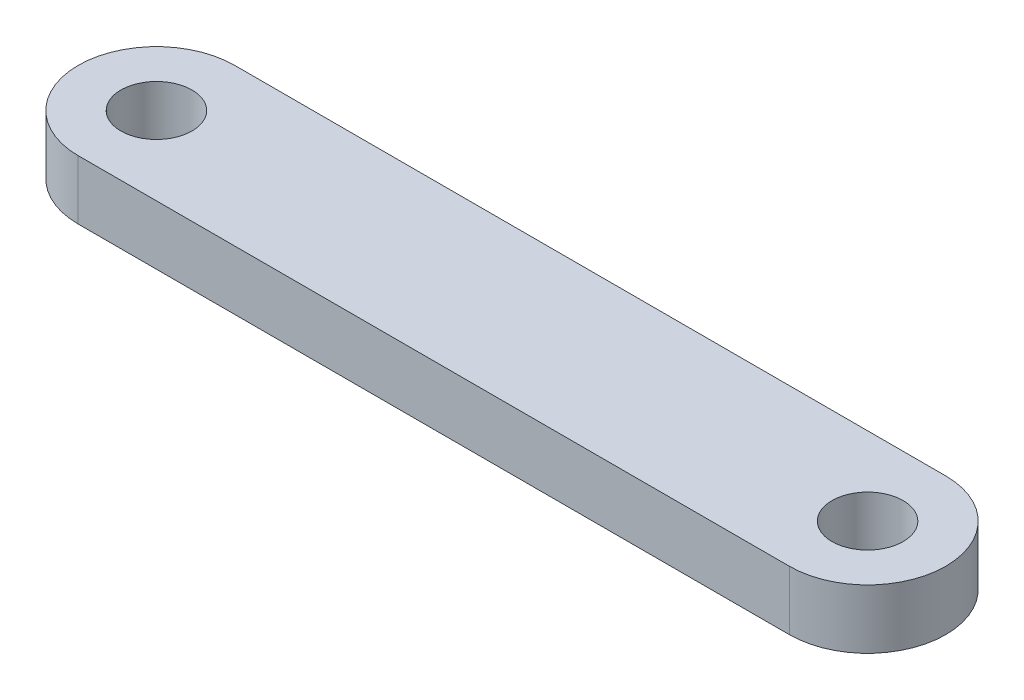
ISO-10303-21;
HEADER;
FILE_DESCRIPTION(('STEP AP214'),'2;1');
FILE_NAME('part.step','',(''),(''),'','','');
FILE_SCHEMA(('AUTOMOTIVE_DESIGN { 1 0 10303 214 1 1 1 1 }'));
ENDSEC;
DATA;
#1=APPLICATION_CONTEXT('core data for automotive mechanical design processes');
#2=APPLICATION_PROTOCOL_DEFINITION('international standard','automotive_design',2000,#1);
#3=PRODUCT_CONTEXT('',#1,'mechanical');
#4=PRODUCT('Part','Part','',(#3));
#5=PRODUCT_RELATED_PRODUCT_CATEGORY('part','',(#4));
#6=PRODUCT_DEFINITION_FORMATION('','',#4);
#7=PRODUCT_DEFINITION_CONTEXT('part definition',#1,'design');
#8=PRODUCT_DEFINITION('design','',#6,#7);
#9=PRODUCT_DEFINITION_SHAPE('','',#8);
#10=(LENGTH_UNIT() NAMED_UNIT(*) SI_UNIT(.MILLI.,.METRE.));
#11=(NAMED_UNIT(*) PLANE_ANGLE_UNIT() SI_UNIT($,.RADIAN.));
#12=(NAMED_UNIT(*) SI_UNIT($,.STERADIAN.) SOLID_ANGLE_UNIT());
#13=UNCERTAINTY_MEASURE_WITH_UNIT(LENGTH_MEASURE(1.E-05),#10,'distance_accuracy_value','');
#14=(GEOMETRIC_REPRESENTATION_CONTEXT(3) GLOBAL_UNCERTAINTY_ASSIGNED_CONTEXT((#13)) GLOBAL_UNIT_ASSIGNED_CONTEXT((#10,
#11,#12)) REPRESENTATION_CONTEXT('',''));
#15=CARTESIAN_POINT('',(0.,0.,0.));
#16=DIRECTION('',(0.,0.,1.));
#17=DIRECTION('',(1.,0.,0.));
#18=AXIS2_PLACEMENT_3D('',#15,#16,#17);
#19=CARTESIAN_POINT('',(0.,12.7,16.764));
#20=DIRECTION('',(0.,0.,-1.));
#21=DIRECTION('',(-1.,0.,0.));
#22=AXIS2_PLACEMENT_3D('',#19,#20,#21);
#23=PLANE('',#22);
#24=DIRECTION('',(1.,0.,0.));
#25=VECTOR('',#24,1.);
#26=CARTESIAN_POINT('',(0.,0.,16.764));
#27=LINE('',#26,#25);
#28=CARTESIAN_POINT('',(0.,0.,16.764));
#29=VERTEX_POINT('',#28);
#30=CARTESIAN_POINT('',(152.4,0.,16.764));
#31=VERTEX_POINT('',#30);
#32=EDGE_CURVE('E117',#29,#31,#27,.T.);
#33=ORIENTED_EDGE('',*,*,#32,.T.);
#34=DIRECTION('',(0.,-1.,0.));
#35=VECTOR('',#34,1.);
#36=CARTESIAN_POINT('',(152.4,12.7,16.764));
#37=LINE('',#36,#35);
#38=CARTESIAN_POINT('',(152.4,12.7,16.764));
#39=VERTEX_POINT('',#38);
#40=EDGE_CURVE('E11',#39,#31,#37,.T.);
#41=ORIENTED_EDGE('',*,*,#40,.F.);
#42=DIRECTION('',(1.,0.,0.));
#43=VECTOR('',#42,1.);
#44=CARTESIAN_POINT('',(0.,12.7,16.764));
#45=LINE('',#44,#43);
#46=CARTESIAN_POINT('',(0.,12.7,16.764));
#47=VERTEX_POINT('',#46);
#48=EDGE_CURVE('E90',#47,#39,#45,.T.);
#49=ORIENTED_EDGE('',*,*,#48,.F.);
#50=DIRECTION('',(0.,-1.,0.));
#51=VECTOR('',#50,1.);
#52=CARTESIAN_POINT('',(0.,12.7,16.764));
#53=LINE('',#52,#51);
#54=EDGE_CURVE('E105',#47,#29,#53,.T.);
#55=ORIENTED_EDGE('',*,*,#54,.T.);
#56=EDGE_LOOP('',(#33,#41,#49,#55));
#57=FACE_BOUND('',#56,.T.);
#58=ADVANCED_FACE('F41',(#57),#23,.F.);
#59=CARTESIAN_POINT('',(152.4,12.7,0.));
#60=DIRECTION('',(0.,-1.,0.));
#61=DIRECTION('',(0.,0.,-1.));
#62=AXIS2_PLACEMENT_3D('',#59,#60,#61);
#63=CYLINDRICAL_SURFACE('',#62,16.764);
#64=CARTESIAN_POINT('',(152.4,0.,0.));
#65=DIRECTION('',(0.,1.,0.));
#66=DIRECTION('',(0.,0.,1.));
#67=AXIS2_PLACEMENT_3D('',#64,#65,#66);
#68=CIRCLE('',#67,16.764);
#69=CARTESIAN_POINT('',(152.4,0.,-16.764));
#70=VERTEX_POINT('',#69);
#71=EDGE_CURVE('E96',#31,#70,#68,.T.);
#72=ORIENTED_EDGE('',*,*,#71,.T.);
#73=DIRECTION('',(0.,-1.,0.));
#74=VECTOR('',#73,1.);
#75=CARTESIAN_POINT('',(152.4,12.7,-16.764));
#76=LINE('',#75,#74);
#77=CARTESIAN_POINT('',(152.4,12.7,-16.764));
#78=VERTEX_POINT('',#77);
#79=EDGE_CURVE('E51',#78,#70,#76,.T.);
#80=ORIENTED_EDGE('',*,*,#79,.F.);
#81=CARTESIAN_POINT('',(152.4,12.7,0.));
#82=DIRECTION('',(0.,1.,0.));
#83=DIRECTION('',(0.,0.,1.));
#84=AXIS2_PLACEMENT_3D('',#81,#82,#83);
#85=CIRCLE('',#84,16.764);
#86=EDGE_CURVE('E85',#39,#78,#85,.T.);
#87=ORIENTED_EDGE('',*,*,#86,.F.);
#88=ORIENTED_EDGE('',*,*,#40,.T.);
#89=EDGE_LOOP('',(#72,#80,#87,#88));
#90=FACE_BOUND('',#89,.T.);
#91=ADVANCED_FACE('F95',(#90),#63,.T.);
#92=CARTESIAN_POINT('',(0.,12.7,-16.764));
#93=DIRECTION('',(0.,0.,-1.));
#94=DIRECTION('',(-1.,0.,0.));
#95=AXIS2_PLACEMENT_3D('',#92,#93,#94);
#96=PLANE('',#95);
#97=DIRECTION('',(1.,0.,0.));
#98=VECTOR('',#97,1.);
#99=CARTESIAN_POINT('',(0.,0.,-16.764));
#100=LINE('',#99,#98);
#101=CARTESIAN_POINT('',(0.,0.,-16.764));
#102=VERTEX_POINT('',#101);
#103=EDGE_CURVE('E123',#102,#70,#100,.T.);
#104=ORIENTED_EDGE('',*,*,#103,.F.);
#105=DIRECTION('',(0.,-1.,0.));
#106=VECTOR('',#105,1.);
#107=CARTESIAN_POINT('',(0.,12.7,-16.764));
#108=LINE('',#107,#106);
#109=CARTESIAN_POINT('',(0.,12.7,-16.764));
#110=VERTEX_POINT('',#109);
#111=EDGE_CURVE('E75',#110,#102,#108,.T.);
#112=ORIENTED_EDGE('',*,*,#111,.F.);
#113=DIRECTION('',(1.,0.,0.));
#114=VECTOR('',#113,1.);
#115=CARTESIAN_POINT('',(0.,12.7,-16.764));
#116=LINE('',#115,#114);
#117=EDGE_CURVE('E88',#110,#78,#116,.T.);
#118=ORIENTED_EDGE('',*,*,#117,.T.);
#119=ORIENTED_EDGE('',*,*,#79,.T.);
#120=EDGE_LOOP('',(#104,#112,#118,#119));
#121=FACE_BOUND('',#120,.T.);
#122=ADVANCED_FACE('F101',(#121),#96,.T.);
#123=CARTESIAN_POINT('',(0.,12.7,0.));
#124=DIRECTION('',(0.,-1.,0.));
#125=DIRECTION('',(0.,0.,-1.));
#126=AXIS2_PLACEMENT_3D('',#123,#124,#125);
#127=CYLINDRICAL_SURFACE('',#126,7.62);
#128=CARTESIAN_POINT('',(0.,12.7,0.));
#129=DIRECTION('',(0.,1.,0.));
#130=DIRECTION('',(0.,0.,1.));
#131=AXIS2_PLACEMENT_3D('',#128,#129,#130);
#132=CIRCLE('',#131,7.62);
#133=CARTESIAN_POINT('',(0.,12.7,7.62));
#134=VERTEX_POINT('',#133);
#135=EDGE_CURVE('E165',#134,#134,#132,.T.);
#136=ORIENTED_EDGE('',*,*,#135,.T.);
#137=EDGE_LOOP('',(#136));
#138=FACE_BOUND('',#137,.T.);
#139=CARTESIAN_POINT('',(0.,0.,0.));
#140=DIRECTION('',(0.,1.,0.));
#141=DIRECTION('',(0.,0.,1.));
#142=AXIS2_PLACEMENT_3D('',#139,#140,#141);
#143=CIRCLE('',#142,7.62);
#144=CARTESIAN_POINT('',(0.,0.,7.62));
#145=VERTEX_POINT('',#144);
#146=EDGE_CURVE('E113',#145,#145,#143,.T.);
#147=ORIENTED_EDGE('',*,*,#146,.F.);
#148=EDGE_LOOP('',(#147));
#149=FACE_BOUND('',#148,.T.);
#150=ADVANCED_FACE('F154',(#138,#149),#127,.F.);
#151=CARTESIAN_POINT('',(152.4,12.7,0.));
#152=DIRECTION('',(0.,-1.,0.));
#153=DIRECTION('',(0.,0.,-1.));
#154=AXIS2_PLACEMENT_3D('',#151,#152,#153);
#155=CYLINDRICAL_SURFACE('',#154,7.62);
#156=CARTESIAN_POINT('',(152.4,12.7,0.));
#157=DIRECTION('',(0.,1.,0.));
#158=DIRECTION('',(0.,0.,1.));
#159=AXIS2_PLACEMENT_3D('',#156,#157,#158);
#160=CIRCLE('',#159,7.62);
#161=CARTESIAN_POINT('',(152.4,12.7,7.62));
#162=VERTEX_POINT('',#161);
#163=EDGE_CURVE('E128',#162,#162,#160,.T.);
#164=ORIENTED_EDGE('',*,*,#163,.T.);
#165=EDGE_LOOP('',(#164));
#166=FACE_BOUND('',#165,.T.);
#167=CARTESIAN_POINT('',(152.4,0.,0.));
#168=DIRECTION('',(0.,1.,0.));
#169=DIRECTION('',(0.,0.,1.));
#170=AXIS2_PLACEMENT_3D('',#167,#168,#169);
#171=CIRCLE('',#170,7.62);
#172=CARTESIAN_POINT('',(152.4,0.,7.62));
#173=VERTEX_POINT('',#172);
#174=EDGE_CURVE('E109',#173,#173,#171,.T.);
#175=ORIENTED_EDGE('',*,*,#174,.F.);
#176=EDGE_LOOP('',(#175));
#177=FACE_BOUND('',#176,.T.);
#178=ADVANCED_FACE('F43',(#166,#177),#155,.F.);
#179=CARTESIAN_POINT('',(0.,12.7,0.));
#180=DIRECTION('',(0.,-1.,0.));
#181=DIRECTION('',(0.,0.,-1.));
#182=AXIS2_PLACEMENT_3D('',#179,#180,#181);
#183=CYLINDRICAL_SURFACE('',#182,16.764);
#184=CARTESIAN_POINT('',(0.,0.,0.));
#185=DIRECTION('',(0.,1.,0.));
#186=DIRECTION('',(0.,0.,1.));
#187=AXIS2_PLACEMENT_3D('',#184,#185,#186);
#188=CIRCLE('',#187,16.764);
#189=EDGE_CURVE('E78',#102,#29,#188,.T.);
#190=ORIENTED_EDGE('',*,*,#189,.T.);
#191=ORIENTED_EDGE('',*,*,#54,.F.);
#192=CARTESIAN_POINT('',(0.,12.7,0.));
#193=DIRECTION('',(0.,1.,0.));
#194=DIRECTION('',(0.,0.,1.));
#195=AXIS2_PLACEMENT_3D('',#192,#193,#194);
#196=CIRCLE('',#195,16.764);
#197=EDGE_CURVE('E59',#110,#47,#196,.T.);
#198=ORIENTED_EDGE('',*,*,#197,.F.);
#199=ORIENTED_EDGE('',*,*,#111,.T.);
#200=EDGE_LOOP('',(#190,#191,#198,#199));
#201=FACE_BOUND('',#200,.T.);
#202=ADVANCED_FACE('F142',(#201),#183,.T.);
#203=CARTESIAN_POINT('',(0.,12.7,0.));
#204=DIRECTION('',(0.,1.,0.));
#205=DIRECTION('',(0.,0.,1.));
#206=AXIS2_PLACEMENT_3D('',#203,#204,#205);
#207=PLANE('',#206);
#208=ORIENTED_EDGE('',*,*,#163,.F.);
#209=EDGE_LOOP('',(#208));
#210=FACE_BOUND('',#209,.T.);
#211=ORIENTED_EDGE('',*,*,#135,.F.);
#212=EDGE_LOOP('',(#211));
#213=FACE_BOUND('',#212,.T.);
#214=ORIENTED_EDGE('',*,*,#48,.T.);
#215=ORIENTED_EDGE('',*,*,#86,.T.);
#216=ORIENTED_EDGE('',*,*,#117,.F.);
#217=ORIENTED_EDGE('',*,*,#197,.T.);
#218=EDGE_LOOP('',(#214,#215,#216,#217));
#219=FACE_BOUND('',#218,.T.);
#220=ADVANCED_FACE('F86',(#210,#213,#219),#207,.T.);
#221=CARTESIAN_POINT('',(0.,0.,0.));
#222=DIRECTION('',(0.,1.,0.));
#223=DIRECTION('',(0.,0.,1.));
#224=AXIS2_PLACEMENT_3D('',#221,#222,#223);
#225=PLANE('',#224);
#226=ORIENTED_EDGE('',*,*,#174,.T.);
#227=EDGE_LOOP('',(#226));
#228=FACE_BOUND('',#227,.T.);
#229=ORIENTED_EDGE('',*,*,#146,.T.);
#230=EDGE_LOOP('',(#229));
#231=FACE_BOUND('',#230,.T.);
#232=ORIENTED_EDGE('',*,*,#32,.F.);
#233=ORIENTED_EDGE('',*,*,#189,.F.);
#234=ORIENTED_EDGE('',*,*,#103,.T.);
#235=ORIENTED_EDGE('',*,*,#71,.F.);
#236=EDGE_LOOP('',(#232,#233,#234,#235));
#237=FACE_BOUND('',#236,.T.);
#238=ADVANCED_FACE('F135',(#228,#231,#237),#225,.F.);
#239=CLOSED_SHELL('',(#58,#91,#122,#150,#178,#202,#220,#238));
#240=MANIFOLD_SOLID_BREP('B2',#239);
#241=ADVANCED_BREP_SHAPE_REPRESENTATION('',(#18,#240),#14);
#242=SHAPE_DEFINITION_REPRESENTATION(#9,#241);
ENDSEC;
END-ISO-10303-21;
